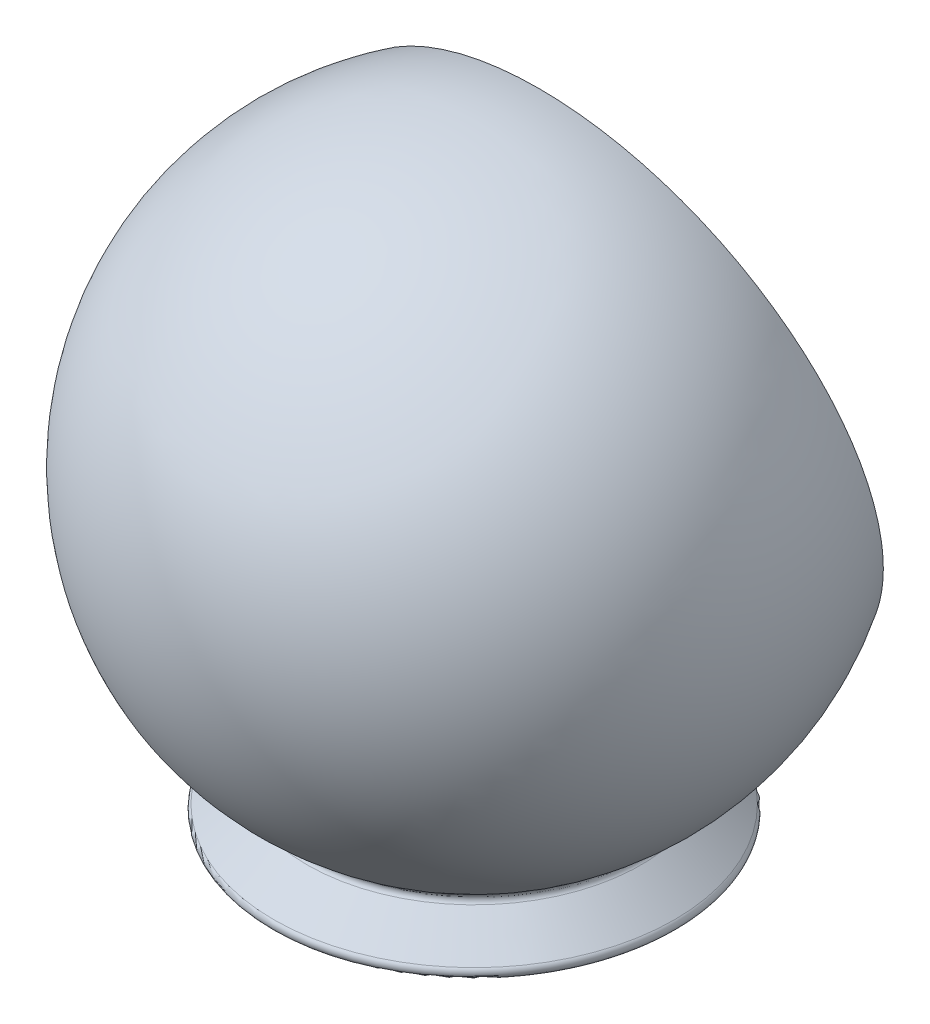
ISO-10303-21;
HEADER;
FILE_DESCRIPTION(('STEP AP214'),'2;1');
FILE_NAME('part.step','',(''),(''),'','','');
FILE_SCHEMA(('AUTOMOTIVE_DESIGN { 1 0 10303 214 1 1 1 1 }'));
ENDSEC;
DATA;
#1=APPLICATION_CONTEXT('core data for automotive mechanical design processes');
#2=APPLICATION_PROTOCOL_DEFINITION('international standard','automotive_design',2000,#1);
#3=PRODUCT_CONTEXT('',#1,'mechanical');
#4=PRODUCT('Part','Part','',(#3));
#5=PRODUCT_RELATED_PRODUCT_CATEGORY('part','',(#4));
#6=PRODUCT_DEFINITION_FORMATION('','',#4);
#7=PRODUCT_DEFINITION_CONTEXT('part definition',#1,'design');
#8=PRODUCT_DEFINITION('design','',#6,#7);
#9=PRODUCT_DEFINITION_SHAPE('','',#8);
#10=(LENGTH_UNIT() NAMED_UNIT(*) SI_UNIT(.MILLI.,.METRE.));
#11=(NAMED_UNIT(*) PLANE_ANGLE_UNIT() SI_UNIT($,.RADIAN.));
#12=(NAMED_UNIT(*) SI_UNIT($,.STERADIAN.) SOLID_ANGLE_UNIT());
#13=UNCERTAINTY_MEASURE_WITH_UNIT(LENGTH_MEASURE(1.E-05),#10,'distance_accuracy_value','');
#14=(GEOMETRIC_REPRESENTATION_CONTEXT(3) GLOBAL_UNCERTAINTY_ASSIGNED_CONTEXT((#13)) GLOBAL_UNIT_ASSIGNED_CONTEXT((#10,
#11,#12)) REPRESENTATION_CONTEXT('',''));
#15=CARTESIAN_POINT('',(0.,0.,0.));
#16=DIRECTION('',(0.,0.,1.));
#17=DIRECTION('',(1.,0.,0.));
#18=AXIS2_PLACEMENT_3D('',#15,#16,#17);
#19=CARTESIAN_POINT('',(0.,0.,0.));
#20=DIRECTION('',(0.,0.,-1.));
#21=DIRECTION('',(1.,0.,0.));
#22=AXIS2_PLACEMENT_3D('',#19,#20,#21);
#23=SPHERICAL_SURFACE('',#22,63.5);
#24=CARTESIAN_POINT('',(0.,-52.8401968368202,0.));
#25=DIRECTION('',(0.,1.,0.));
#26=DIRECTION('',(0.,0.,1.));
#27=AXIS2_PLACEMENT_3D('',#24,#25,#26);
#28=CIRCLE('',#27,35.2159565857027);
#29=CARTESIAN_POINT('',(0.,-52.8401968368202,35.2159565857027));
#30=VERTEX_POINT('',#29);
#31=EDGE_CURVE('E99',#30,#30,#28,.T.);
#32=ORIENTED_EDGE('',*,*,#31,.T.);
#33=EDGE_LOOP('',(#32));
#34=FACE_BOUND('',#33,.T.);
#35=CARTESIAN_POINT('',(0.,6.83579706656642,-27.4168845401052));
#36=DIRECTION('',(0.,0.241921895599665,-0.970295726275997));
#37=DIRECTION('',(0.,0.970295726275997,0.241921895599665));
#38=AXIS2_PLACEMENT_3D('',#35,#36,#37);
#39=CIRCLE('',#38,56.8668297039607);
#40=CARTESIAN_POINT('',(0.,62.0134388951844,-13.6595533013797));
#41=VERTEX_POINT('',#40);
#42=EDGE_CURVE('E57',#41,#41,#39,.T.);
#43=ORIENTED_EDGE('',*,*,#42,.F.);
#44=EDGE_LOOP('',(#43));
#45=FACE_BOUND('',#44,.T.);
#46=ADVANCED_FACE('F53',(#34,#45),#23,.T.);
#47=CARTESIAN_POINT('',(0.,-48.26,0.));
#48=DIRECTION('',(0.,-1.,0.));
#49=DIRECTION('',(0.,0.,-1.));
#50=AXIS2_PLACEMENT_3D('',#47,#48,#49);
#51=CONICAL_SURFACE('',#50,27.9420075657591,0.825316242307476);
#52=CARTESIAN_POINT('',(0.,-61.2968518359054,0.));
#53=DIRECTION('',(0.,-1.,0.));
#54=DIRECTION('',(0.,0.,-1.));
#55=AXIS2_PLACEMENT_3D('',#52,#53,#54);
#56=CIRCLE('',#55,42.0635463763526);
#57=CARTESIAN_POINT('',(0.,-61.2968518359054,-42.0635463763526));
#58=VERTEX_POINT('',#57);
#59=EDGE_CURVE('E62',#58,#58,#56,.F.);
#60=ORIENTED_EDGE('',*,*,#59,.T.);
#61=EDGE_LOOP('',(#60));
#62=FACE_BOUND('',#61,.T.);
#63=CARTESIAN_POINT('',(0.,-54.8301489376512,0.));
#64=DIRECTION('',(0.,1.,0.));
#65=DIRECTION('',(0.,0.,1.));
#66=AXIS2_PLACEMENT_3D('',#63,#64,#65);
#67=CIRCLE('',#66,35.0588034289206);
#68=CARTESIAN_POINT('',(0.,-54.8301489376512,35.0588034289206));
#69=VERTEX_POINT('',#68);
#70=EDGE_CURVE('E96',#69,#69,#67,.F.);
#71=ORIENTED_EDGE('',*,*,#70,.T.);
#72=EDGE_LOOP('',(#71));
#73=FACE_BOUND('',#72,.T.);
#74=ADVANCED_FACE('F68',(#62,#73),#51,.T.);
#75=CARTESIAN_POINT('',(0.,-63.5,0.));
#76=DIRECTION('',(0.,1.,0.));
#77=DIRECTION('',(0.,0.,1.));
#78=AXIS2_PLACEMENT_3D('',#75,#76,#77);
#79=PLANE('',#78);
#80=CARTESIAN_POINT('',(0.,-63.5,0.));
#81=DIRECTION('',(0.,1.,0.));
#82=DIRECTION('',(0.,0.,1.));
#83=AXIS2_PLACEMENT_3D('',#80,#81,#82);
#84=CIRCLE('',#83,41.2020740878565);
#85=CARTESIAN_POINT('',(0.,-63.5,41.2020740878565));
#86=VERTEX_POINT('',#85);
#87=EDGE_CURVE('E12',#86,#86,#84,.F.);
#88=ORIENTED_EDGE('',*,*,#87,.T.);
#89=EDGE_LOOP('',(#88));
#90=FACE_BOUND('',#89,.T.);
#91=CARTESIAN_POINT('',(0.,-63.5,0.));
#92=VERTEX_POINT('',#91);
#93=VERTEX_LOOP('',#92);
#94=FACE_BOUND('',#93,.T.);
#95=ADVANCED_FACE('F65',(#90,#94),#79,.F.);
#96=CARTESIAN_POINT('',(0.,-53.8970007735566,0.));
#97=DIRECTION('',(0.,1.,0.));
#98=DIRECTION('',(0.,0.,1.));
#99=AXIS2_PLACEMENT_3D('',#96,#97,#98);
#100=TOROIDAL_SURFACE('',#99,35.9202757174168,1.27);
#101=ORIENTED_EDGE('',*,*,#31,.F.);
#102=EDGE_LOOP('',(#101));
#103=FACE_BOUND('',#102,.T.);
#104=ORIENTED_EDGE('',*,*,#70,.F.);
#105=EDGE_LOOP('',(#104));
#106=FACE_BOUND('',#105,.T.);
#107=ADVANCED_FACE('F67',(#103,#106),#100,.F.);
#108=CARTESIAN_POINT('',(0.,-62.23,0.));
#109=DIRECTION('',(0.,1.,0.));
#110=DIRECTION('',(0.,0.,1.));
#111=AXIS2_PLACEMENT_3D('',#108,#109,#110);
#112=TOROIDAL_SURFACE('',#111,41.2020740878565,1.27);
#113=ORIENTED_EDGE('',*,*,#87,.F.);
#114=EDGE_LOOP('',(#113));
#115=FACE_BOUND('',#114,.T.);
#116=ORIENTED_EDGE('',*,*,#59,.F.);
#117=EDGE_LOOP('',(#116));
#118=FACE_BOUND('',#117,.T.);
#119=ADVANCED_FACE('F55',(#115,#118),#112,.T.);
#120=CARTESIAN_POINT('',(0.,6.83579706656642,-27.4168845401052));
#121=DIRECTION('',(0.,0.241921895599665,-0.970295726275997));
#122=DIRECTION('',(0.,0.970295726275997,0.241921895599665));
#123=AXIS2_PLACEMENT_3D('',#120,#121,#122);
#124=PLANE('',#123);
#125=ORIENTED_EDGE('',*,*,#42,.T.);
#126=EDGE_LOOP('',(#125));
#127=FACE_BOUND('',#126,.T.);
#128=ADVANCED_FACE('F88',(#127),#124,.T.);
#129=CLOSED_SHELL('',(#46,#74,#95,#107,#119,#128));
#130=MANIFOLD_SOLID_BREP('B2',#129);
#131=ADVANCED_BREP_SHAPE_REPRESENTATION('',(#18,#130),#14);
#132=SHAPE_DEFINITION_REPRESENTATION(#9,#131);
ENDSEC;
END-ISO-10303-21;
